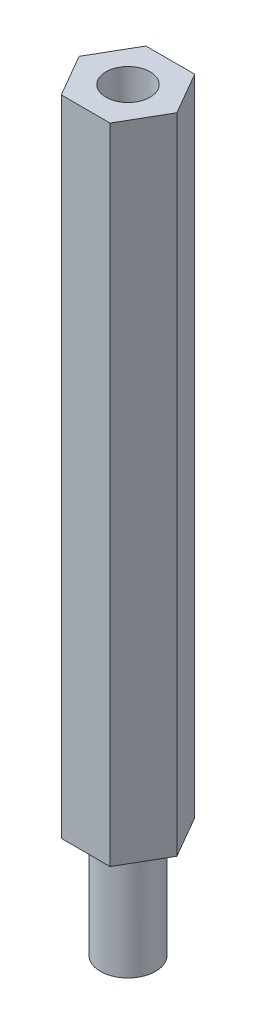
ISO-10303-21;
HEADER;
FILE_DESCRIPTION(('STEP AP214'),'2;1');
FILE_NAME('part.step','',(''),(''),'','','');
FILE_SCHEMA(('AUTOMOTIVE_DESIGN { 1 0 10303 214 1 1 1 1 }'));
ENDSEC;
DATA;
#1=APPLICATION_CONTEXT('core data for automotive mechanical design processes');
#2=APPLICATION_PROTOCOL_DEFINITION('international standard','automotive_design',2000,#1);
#3=PRODUCT_CONTEXT('',#1,'mechanical');
#4=PRODUCT('Part','Part','',(#3));
#5=PRODUCT_RELATED_PRODUCT_CATEGORY('part','',(#4));
#6=PRODUCT_DEFINITION_FORMATION('','',#4);
#7=PRODUCT_DEFINITION_CONTEXT('part definition',#1,'design');
#8=PRODUCT_DEFINITION('design','',#6,#7);
#9=PRODUCT_DEFINITION_SHAPE('','',#8);
#10=(LENGTH_UNIT() NAMED_UNIT(*) SI_UNIT(.MILLI.,.METRE.));
#11=(NAMED_UNIT(*) PLANE_ANGLE_UNIT() SI_UNIT($,.RADIAN.));
#12=(NAMED_UNIT(*) SI_UNIT($,.STERADIAN.) SOLID_ANGLE_UNIT());
#13=UNCERTAINTY_MEASURE_WITH_UNIT(LENGTH_MEASURE(1.E-05),#10,'distance_accuracy_value','');
#14=(GEOMETRIC_REPRESENTATION_CONTEXT(3) GLOBAL_UNCERTAINTY_ASSIGNED_CONTEXT((#13)) GLOBAL_UNIT_ASSIGNED_CONTEXT((#10,
#11,#12)) REPRESENTATION_CONTEXT('',''));
#15=CARTESIAN_POINT('',(0.,0.,0.));
#16=DIRECTION('',(0.,0.,1.));
#17=DIRECTION('',(1.,0.,0.));
#18=AXIS2_PLACEMENT_3D('',#15,#16,#17);
#19=CARTESIAN_POINT('',(0.,35.,0.));
#20=DIRECTION('',(0.,1.,0.));
#21=DIRECTION('',(0.,0.,1.));
#22=AXIS2_PLACEMENT_3D('',#19,#20,#21);
#23=PLANE('',#22);
#24=DIRECTION('',(0.499999999999995,0.,-0.866025403784442));
#25=VECTOR('',#24,1.);
#26=CARTESIAN_POINT('',(1.32790561913616,35.,2.29999999999998));
#27=LINE('',#26,#25);
#28=CARTESIAN_POINT('',(1.32790561913616,35.,2.29999999999998));
#29=VERTEX_POINT('',#28);
#30=CARTESIAN_POINT('',(2.65581123827227,35.,0.));
#31=VERTEX_POINT('',#30);
#32=EDGE_CURVE('E147',#29,#31,#27,.T.);
#33=ORIENTED_EDGE('',*,*,#32,.T.);
#34=DIRECTION('',(-0.500000000000001,0.,-0.866025403784438));
#35=VECTOR('',#34,1.);
#36=CARTESIAN_POINT('',(2.65581123827227,35.,0.));
#37=LINE('',#36,#35);
#38=CARTESIAN_POINT('',(1.32790561913613,35.,-2.3));
#39=VERTEX_POINT('',#38);
#40=EDGE_CURVE('E95',#31,#39,#37,.T.);
#41=ORIENTED_EDGE('',*,*,#40,.T.);
#42=DIRECTION('',(-1.,0.,0.));
#43=VECTOR('',#42,1.);
#44=CARTESIAN_POINT('',(1.32790561913613,35.,-2.3));
#45=LINE('',#44,#43);
#46=CARTESIAN_POINT('',(-1.32790561913615,35.,-2.29999999999999));
#47=VERTEX_POINT('',#46);
#48=EDGE_CURVE('E108',#39,#47,#45,.T.);
#49=ORIENTED_EDGE('',*,*,#48,.T.);
#50=DIRECTION('',(-0.499999999999995,0.,0.866025403784442));
#51=VECTOR('',#50,1.);
#52=CARTESIAN_POINT('',(-1.32790561913615,35.,-2.29999999999999));
#53=LINE('',#52,#51);
#54=CARTESIAN_POINT('',(-2.65581123827227,35.,0.));
#55=VERTEX_POINT('',#54);
#56=EDGE_CURVE('E102',#47,#55,#53,.T.);
#57=ORIENTED_EDGE('',*,*,#56,.T.);
#58=DIRECTION('',(0.500000000000007,0.,0.866025403784435));
#59=VECTOR('',#58,1.);
#60=CARTESIAN_POINT('',(-2.65581123827227,35.,0.));
#61=LINE('',#60,#59);
#62=CARTESIAN_POINT('',(-1.32790561913612,35.,2.30000000000001));
#63=VERTEX_POINT('',#62);
#64=EDGE_CURVE('E106',#55,#63,#61,.T.);
#65=ORIENTED_EDGE('',*,*,#64,.T.);
#66=DIRECTION('',(1.,0.,0.));
#67=VECTOR('',#66,1.);
#68=CARTESIAN_POINT('',(-1.32790561913612,35.,2.30000000000001));
#69=LINE('',#68,#67);
#70=EDGE_CURVE('E57',#63,#29,#69,.T.);
#71=ORIENTED_EDGE('',*,*,#70,.T.);
#72=EDGE_LOOP('',(#33,#41,#49,#57,#65,#71));
#73=FACE_BOUND('',#72,.T.);
#74=CARTESIAN_POINT('',(0.,35.,0.));
#75=DIRECTION('',(0.,1.,0.));
#76=DIRECTION('',(0.,0.,1.));
#77=AXIS2_PLACEMENT_3D('',#74,#75,#76);
#78=CIRCLE('',#77,1.2);
#79=CARTESIAN_POINT('',(0.,35.,1.2));
#80=VERTEX_POINT('',#79);
#81=EDGE_CURVE('E135',#80,#80,#78,.T.);
#82=ORIENTED_EDGE('',*,*,#81,.F.);
#83=EDGE_LOOP('',(#82));
#84=FACE_BOUND('',#83,.T.);
#85=ADVANCED_FACE('F39',(#73,#84),#23,.T.);
#86=CARTESIAN_POINT('',(0.,0.,0.));
#87=DIRECTION('',(0.,1.,0.));
#88=DIRECTION('',(0.,0.,1.));
#89=AXIS2_PLACEMENT_3D('',#86,#87,#88);
#90=PLANE('',#89);
#91=CARTESIAN_POINT('',(0.,0.,0.));
#92=DIRECTION('',(0.,1.,0.));
#93=DIRECTION('',(0.,0.,1.));
#94=AXIS2_PLACEMENT_3D('',#91,#92,#93);
#95=CIRCLE('',#94,1.5);
#96=CARTESIAN_POINT('',(0.,0.,1.5));
#97=VERTEX_POINT('',#96);
#98=EDGE_CURVE('E11',#97,#97,#95,.F.);
#99=ORIENTED_EDGE('',*,*,#98,.F.);
#100=EDGE_LOOP('',(#99));
#101=FACE_BOUND('',#100,.T.);
#102=DIRECTION('',(0.499999999999995,0.,-0.866025403784442));
#103=VECTOR('',#102,1.);
#104=CARTESIAN_POINT('',(1.32790561913616,0.,2.29999999999998));
#105=LINE('',#104,#103);
#106=CARTESIAN_POINT('',(1.32790561913616,0.,2.29999999999998));
#107=VERTEX_POINT('',#106);
#108=CARTESIAN_POINT('',(2.65581123827227,0.,0.));
#109=VERTEX_POINT('',#108);
#110=EDGE_CURVE('E130',#107,#109,#105,.T.);
#111=ORIENTED_EDGE('',*,*,#110,.F.);
#112=DIRECTION('',(1.,0.,0.));
#113=VECTOR('',#112,1.);
#114=CARTESIAN_POINT('',(-1.32790561913612,0.,2.30000000000001));
#115=LINE('',#114,#113);
#116=CARTESIAN_POINT('',(-1.32790561913612,0.,2.30000000000001));
#117=VERTEX_POINT('',#116);
#118=EDGE_CURVE('E86',#117,#107,#115,.T.);
#119=ORIENTED_EDGE('',*,*,#118,.F.);
#120=DIRECTION('',(0.500000000000007,0.,0.866025403784435));
#121=VECTOR('',#120,1.);
#122=CARTESIAN_POINT('',(-2.65581123827227,0.,0.));
#123=LINE('',#122,#121);
#124=CARTESIAN_POINT('',(-2.65581123827227,0.,0.));
#125=VERTEX_POINT('',#124);
#126=EDGE_CURVE('E80',#125,#117,#123,.T.);
#127=ORIENTED_EDGE('',*,*,#126,.F.);
#128=DIRECTION('',(-0.499999999999995,0.,0.866025403784442));
#129=VECTOR('',#128,1.);
#130=CARTESIAN_POINT('',(-1.32790561913615,0.,-2.29999999999999));
#131=LINE('',#130,#129);
#132=CARTESIAN_POINT('',(-1.32790561913615,0.,-2.29999999999999));
#133=VERTEX_POINT('',#132);
#134=EDGE_CURVE('E117',#133,#125,#131,.T.);
#135=ORIENTED_EDGE('',*,*,#134,.F.);
#136=DIRECTION('',(-1.,0.,0.));
#137=VECTOR('',#136,1.);
#138=CARTESIAN_POINT('',(1.32790561913613,0.,-2.3));
#139=LINE('',#138,#137);
#140=CARTESIAN_POINT('',(1.32790561913613,0.,-2.3));
#141=VERTEX_POINT('',#140);
#142=EDGE_CURVE('E138',#141,#133,#139,.T.);
#143=ORIENTED_EDGE('',*,*,#142,.F.);
#144=DIRECTION('',(-0.500000000000001,0.,-0.866025403784438));
#145=VECTOR('',#144,1.);
#146=CARTESIAN_POINT('',(2.65581123827227,0.,0.));
#147=LINE('',#146,#145);
#148=EDGE_CURVE('E134',#109,#141,#147,.T.);
#149=ORIENTED_EDGE('',*,*,#148,.F.);
#150=EDGE_LOOP('',(#111,#119,#127,#135,#143,#149));
#151=FACE_BOUND('',#150,.T.);
#152=ADVANCED_FACE('F164',(#101,#151),#90,.F.);
#153=CARTESIAN_POINT('',(1.32790561913616,35.,2.29999999999998));
#154=DIRECTION('',(-0.866025403784442,0.,-0.499999999999995));
#155=DIRECTION('',(-0.499999999999995,0.,0.866025403784442));
#156=AXIS2_PLACEMENT_3D('',#153,#154,#155);
#157=PLANE('',#156);
#158=ORIENTED_EDGE('',*,*,#110,.T.);
#159=DIRECTION('',(0.,-1.,0.));
#160=VECTOR('',#159,1.);
#161=CARTESIAN_POINT('',(2.65581123827227,35.,0.));
#162=LINE('',#161,#160);
#163=EDGE_CURVE('E49',#31,#109,#162,.T.);
#164=ORIENTED_EDGE('',*,*,#163,.F.);
#165=ORIENTED_EDGE('',*,*,#32,.F.);
#166=DIRECTION('',(0.,-1.,0.));
#167=VECTOR('',#166,1.);
#168=CARTESIAN_POINT('',(1.32790561913616,35.,2.29999999999998));
#169=LINE('',#168,#167);
#170=EDGE_CURVE('E126',#29,#107,#169,.T.);
#171=ORIENTED_EDGE('',*,*,#170,.T.);
#172=EDGE_LOOP('',(#158,#164,#165,#171));
#173=FACE_BOUND('',#172,.T.);
#174=ADVANCED_FACE('F41',(#173),#157,.F.);
#175=CARTESIAN_POINT('',(2.65581123827227,35.,0.));
#176=DIRECTION('',(-0.866025403784438,0.,0.500000000000001));
#177=DIRECTION('',(0.500000000000001,0.,0.866025403784438));
#178=AXIS2_PLACEMENT_3D('',#175,#176,#177);
#179=PLANE('',#178);
#180=ORIENTED_EDGE('',*,*,#148,.T.);
#181=DIRECTION('',(0.,-1.,0.));
#182=VECTOR('',#181,1.);
#183=CARTESIAN_POINT('',(1.32790561913613,35.,-2.3));
#184=LINE('',#183,#182);
#185=EDGE_CURVE('E154',#39,#141,#184,.T.);
#186=ORIENTED_EDGE('',*,*,#185,.F.);
#187=ORIENTED_EDGE('',*,*,#40,.F.);
#188=ORIENTED_EDGE('',*,*,#163,.T.);
#189=EDGE_LOOP('',(#180,#186,#187,#188));
#190=FACE_BOUND('',#189,.T.);
#191=ADVANCED_FACE('F159',(#190),#179,.F.);
#192=CARTESIAN_POINT('',(1.32790561913613,35.,-2.3));
#193=DIRECTION('',(0.,0.,1.));
#194=DIRECTION('',(1.,0.,0.));
#195=AXIS2_PLACEMENT_3D('',#192,#193,#194);
#196=PLANE('',#195);
#197=ORIENTED_EDGE('',*,*,#142,.T.);
#198=DIRECTION('',(0.,-1.,0.));
#199=VECTOR('',#198,1.);
#200=CARTESIAN_POINT('',(-1.32790561913615,35.,-2.29999999999999));
#201=LINE('',#200,#199);
#202=EDGE_CURVE('E119',#47,#133,#201,.T.);
#203=ORIENTED_EDGE('',*,*,#202,.F.);
#204=ORIENTED_EDGE('',*,*,#48,.F.);
#205=ORIENTED_EDGE('',*,*,#185,.T.);
#206=EDGE_LOOP('',(#197,#203,#204,#205));
#207=FACE_BOUND('',#206,.T.);
#208=ADVANCED_FACE('F167',(#207),#196,.F.);
#209=CARTESIAN_POINT('',(-1.32790561913615,35.,-2.29999999999999));
#210=DIRECTION('',(0.866025403784442,0.,0.499999999999995));
#211=DIRECTION('',(0.499999999999995,0.,-0.866025403784442));
#212=AXIS2_PLACEMENT_3D('',#209,#210,#211);
#213=PLANE('',#212);
#214=ORIENTED_EDGE('',*,*,#134,.T.);
#215=DIRECTION('',(0.,-1.,0.));
#216=VECTOR('',#215,1.);
#217=CARTESIAN_POINT('',(-2.65581123827227,35.,0.));
#218=LINE('',#217,#216);
#219=EDGE_CURVE('E114',#55,#125,#218,.T.);
#220=ORIENTED_EDGE('',*,*,#219,.F.);
#221=ORIENTED_EDGE('',*,*,#56,.F.);
#222=ORIENTED_EDGE('',*,*,#202,.T.);
#223=EDGE_LOOP('',(#214,#220,#221,#222));
#224=FACE_BOUND('',#223,.T.);
#225=ADVANCED_FACE('F115',(#224),#213,.F.);
#226=CARTESIAN_POINT('',(-2.65581123827227,35.,0.));
#227=DIRECTION('',(0.866025403784435,0.,-0.500000000000007));
#228=DIRECTION('',(-0.500000000000007,0.,-0.866025403784434));
#229=AXIS2_PLACEMENT_3D('',#226,#227,#228);
#230=PLANE('',#229);
#231=ORIENTED_EDGE('',*,*,#126,.T.);
#232=DIRECTION('',(0.,-1.,0.));
#233=VECTOR('',#232,1.);
#234=CARTESIAN_POINT('',(-1.32790561913612,35.,2.30000000000001));
#235=LINE('',#234,#233);
#236=EDGE_CURVE('E120',#63,#117,#235,.T.);
#237=ORIENTED_EDGE('',*,*,#236,.F.);
#238=ORIENTED_EDGE('',*,*,#64,.F.);
#239=ORIENTED_EDGE('',*,*,#219,.T.);
#240=EDGE_LOOP('',(#231,#237,#238,#239));
#241=FACE_BOUND('',#240,.T.);
#242=ADVANCED_FACE('F122',(#241),#230,.F.);
#243=CARTESIAN_POINT('',(-1.32790561913612,35.,2.30000000000001));
#244=DIRECTION('',(0.,0.,-1.));
#245=DIRECTION('',(-1.,0.,0.));
#246=AXIS2_PLACEMENT_3D('',#243,#244,#245);
#247=PLANE('',#246);
#248=ORIENTED_EDGE('',*,*,#118,.T.);
#249=ORIENTED_EDGE('',*,*,#170,.F.);
#250=ORIENTED_EDGE('',*,*,#70,.F.);
#251=ORIENTED_EDGE('',*,*,#236,.T.);
#252=EDGE_LOOP('',(#248,#249,#250,#251));
#253=FACE_BOUND('',#252,.T.);
#254=ADVANCED_FACE('F204',(#253),#247,.F.);
#255=CARTESIAN_POINT('',(0.,35.,0.));
#256=DIRECTION('',(0.,-1.,0.));
#257=DIRECTION('',(0.,0.,-1.));
#258=AXIS2_PLACEMENT_3D('',#255,#256,#257);
#259=CYLINDRICAL_SURFACE('',#258,1.2);
#260=ORIENTED_EDGE('',*,*,#81,.T.);
#261=EDGE_LOOP('',(#260));
#262=FACE_BOUND('',#261,.T.);
#263=CARTESIAN_POINT('',(0.,0.,0.));
#264=DIRECTION('',(0.,1.,0.));
#265=DIRECTION('',(0.,0.,1.));
#266=AXIS2_PLACEMENT_3D('',#263,#264,#265);
#267=CIRCLE('',#266,1.2);
#268=CARTESIAN_POINT('',(0.,0.,1.2));
#269=VERTEX_POINT('',#268);
#270=EDGE_CURVE('E174',#269,#269,#267,.T.);
#271=ORIENTED_EDGE('',*,*,#270,.F.);
#272=EDGE_LOOP('',(#271));
#273=FACE_BOUND('',#272,.T.);
#274=ADVANCED_FACE('F207',(#262,#273),#259,.F.);
#275=CARTESIAN_POINT('',(0.,0.,0.));
#276=DIRECTION('',(0.,-1.,0.));
#277=DIRECTION('',(0.,0.,-1.));
#278=AXIS2_PLACEMENT_3D('',#275,#276,#277);
#279=PLANE('',#278);
#280=ORIENTED_EDGE('',*,*,#270,.T.);
#281=EDGE_LOOP('',(#280));
#282=FACE_BOUND('',#281,.T.);
#283=ADVANCED_FACE('F191',(#282),#279,.F.);
#284=CARTESIAN_POINT('',(0.,-6.,0.));
#285=DIRECTION('',(0.,1.,0.));
#286=DIRECTION('',(0.,0.,1.));
#287=AXIS2_PLACEMENT_3D('',#284,#285,#286);
#288=CYLINDRICAL_SURFACE('',#287,1.5);
#289=CARTESIAN_POINT('',(0.,-6.,0.));
#290=DIRECTION('',(0.,-1.,0.));
#291=DIRECTION('',(0.,0.,-1.));
#292=AXIS2_PLACEMENT_3D('',#289,#290,#291);
#293=CIRCLE('',#292,1.5);
#294=CARTESIAN_POINT('',(0.,-6.,-1.5));
#295=VERTEX_POINT('',#294);
#296=EDGE_CURVE('E178',#295,#295,#293,.T.);
#297=ORIENTED_EDGE('',*,*,#296,.F.);
#298=EDGE_LOOP('',(#297));
#299=FACE_BOUND('',#298,.T.);
#300=ORIENTED_EDGE('',*,*,#98,.T.);
#301=EDGE_LOOP('',(#300));
#302=FACE_BOUND('',#301,.T.);
#303=ADVANCED_FACE('F188',(#299,#302),#288,.T.);
#304=CARTESIAN_POINT('',(0.,-6.,0.));
#305=DIRECTION('',(0.,-1.,0.));
#306=DIRECTION('',(0.,0.,-1.));
#307=AXIS2_PLACEMENT_3D('',#304,#305,#306);
#308=PLANE('',#307);
#309=ORIENTED_EDGE('',*,*,#296,.T.);
#310=EDGE_LOOP('',(#309));
#311=FACE_BOUND('',#310,.T.);
#312=ADVANCED_FACE('F186',(#311),#308,.T.);
#313=CLOSED_SHELL('',(#85,#152,#174,#191,#208,#225,#242,#254,#274,#283,#303,#312));
#314=MANIFOLD_SOLID_BREP('B2',#313);
#315=ADVANCED_BREP_SHAPE_REPRESENTATION('',(#18,#314),#14);
#316=SHAPE_DEFINITION_REPRESENTATION(#9,#315);
ENDSEC;
END-ISO-10303-21;
